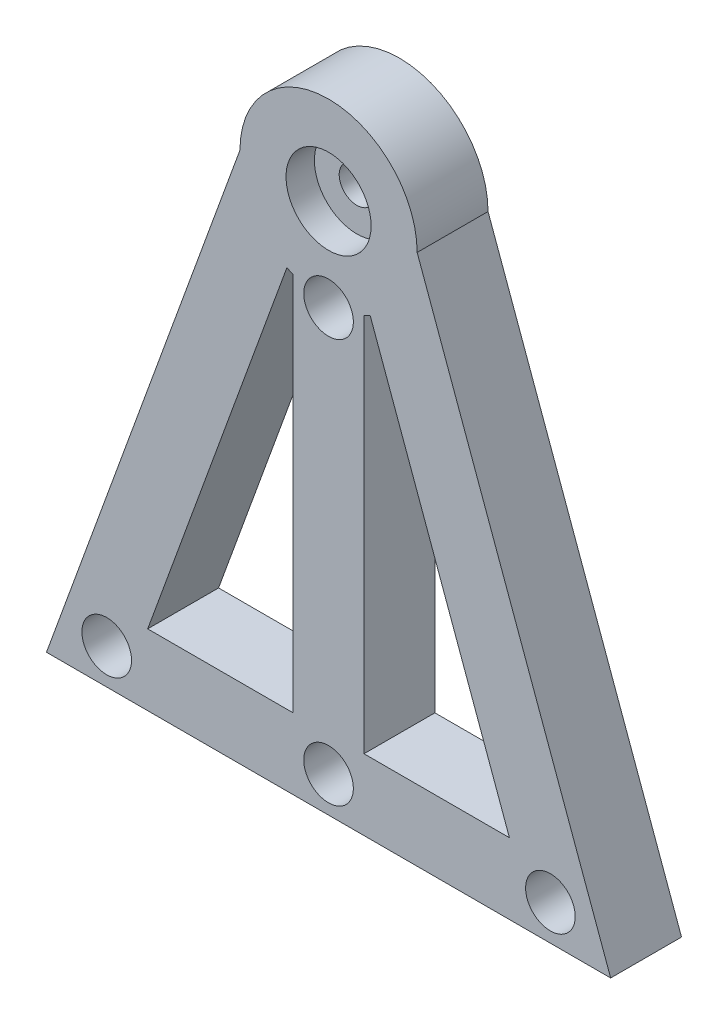
ISO-10303-21;
HEADER;
FILE_DESCRIPTION(('STEP AP214'),'2;1');
FILE_NAME('part.step','',(''),(''),'','','');
FILE_SCHEMA(('AUTOMOTIVE_DESIGN { 1 0 10303 214 1 1 1 1 }'));
ENDSEC;
DATA;
#1=APPLICATION_CONTEXT('core data for automotive mechanical design processes');
#2=APPLICATION_PROTOCOL_DEFINITION('international standard','automotive_design',2000,#1);
#3=PRODUCT_CONTEXT('',#1,'mechanical');
#4=PRODUCT('Part','Part','',(#3));
#5=PRODUCT_RELATED_PRODUCT_CATEGORY('part','',(#4));
#6=PRODUCT_DEFINITION_FORMATION('','',#4);
#7=PRODUCT_DEFINITION_CONTEXT('part definition',#1,'design');
#8=PRODUCT_DEFINITION('design','',#6,#7);
#9=PRODUCT_DEFINITION_SHAPE('','',#8);
#10=(LENGTH_UNIT() NAMED_UNIT(*) SI_UNIT(.MILLI.,.METRE.));
#11=(NAMED_UNIT(*) PLANE_ANGLE_UNIT() SI_UNIT($,.RADIAN.));
#12=(NAMED_UNIT(*) SI_UNIT($,.STERADIAN.) SOLID_ANGLE_UNIT());
#13=UNCERTAINTY_MEASURE_WITH_UNIT(LENGTH_MEASURE(1.E-05),#10,'distance_accuracy_value','');
#14=(GEOMETRIC_REPRESENTATION_CONTEXT(3) GLOBAL_UNCERTAINTY_ASSIGNED_CONTEXT((#13)) GLOBAL_UNIT_ASSIGNED_CONTEXT((#10,
#11,#12)) REPRESENTATION_CONTEXT('',''));
#15=CARTESIAN_POINT('',(0.,0.,0.));
#16=DIRECTION('',(0.,0.,1.));
#17=DIRECTION('',(1.,0.,0.));
#18=AXIS2_PLACEMENT_3D('',#15,#16,#17);
#19=CARTESIAN_POINT('',(0.,62.,-0.000999999999999265));
#20=DIRECTION('',(0.,0.,1.));
#21=DIRECTION('',(1.,0.,0.));
#22=AXIS2_PLACEMENT_3D('',#19,#20,#21);
#23=CYLINDRICAL_SURFACE('',#22,1.5);
#24=CARTESIAN_POINT('',(0.,62.,0.));
#25=DIRECTION('',(0.,0.,1.));
#26=DIRECTION('',(1.,0.,0.));
#27=AXIS2_PLACEMENT_3D('',#24,#25,#26);
#28=CIRCLE('',#27,1.5);
#29=CARTESIAN_POINT('',(1.5,62.,0.));
#30=VERTEX_POINT('',#29);
#31=EDGE_CURVE('E378',#30,#30,#28,.F.);
#32=ORIENTED_EDGE('',*,*,#31,.T.);
#33=EDGE_LOOP('',(#32));
#34=FACE_BOUND('',#33,.T.);
#35=CARTESIAN_POINT('',(0.,62.,5.));
#36=DIRECTION('',(0.,0.,1.));
#37=DIRECTION('',(1.,0.,0.));
#38=AXIS2_PLACEMENT_3D('',#35,#36,#37);
#39=CIRCLE('',#38,1.5);
#40=CARTESIAN_POINT('',(1.5,62.,5.));
#41=VERTEX_POINT('',#40);
#42=EDGE_CURVE('E127',#41,#41,#39,.F.);
#43=ORIENTED_EDGE('',*,*,#42,.F.);
#44=EDGE_LOOP('',(#43));
#45=FACE_BOUND('',#44,.T.);
#46=ADVANCED_FACE('F123',(#34,#45),#23,.F.);
#47=CARTESIAN_POINT('',(31.2977675699655,5.00000000000001,-0.000999999999999265));
#48=DIRECTION('',(0.,0.,1.));
#49=DIRECTION('',(1.,0.,0.));
#50=AXIS2_PLACEMENT_3D('',#47,#48,#49);
#51=CYLINDRICAL_SURFACE('',#50,1.5);
#52=CARTESIAN_POINT('',(31.2977675699655,5.00000000000001,0.));
#53=DIRECTION('',(0.,0.,1.));
#54=DIRECTION('',(1.,0.,0.));
#55=AXIS2_PLACEMENT_3D('',#52,#53,#54);
#56=CIRCLE('',#55,1.5);
#57=CARTESIAN_POINT('',(32.7977675699655,5.00000000000001,0.));
#58=VERTEX_POINT('',#57);
#59=EDGE_CURVE('E374',#58,#58,#56,.F.);
#60=ORIENTED_EDGE('',*,*,#59,.T.);
#61=EDGE_LOOP('',(#60));
#62=FACE_BOUND('',#61,.T.);
#63=CARTESIAN_POINT('',(31.2977675699655,5.00000000000001,5.));
#64=DIRECTION('',(0.,0.,1.));
#65=DIRECTION('',(1.,0.,0.));
#66=AXIS2_PLACEMENT_3D('',#63,#64,#65);
#67=CIRCLE('',#66,1.5);
#68=CARTESIAN_POINT('',(32.7977675699655,5.00000000000001,5.));
#69=VERTEX_POINT('',#68);
#70=EDGE_CURVE('E412',#69,#69,#67,.T.);
#71=ORIENTED_EDGE('',*,*,#70,.T.);
#72=EDGE_LOOP('',(#71));
#73=FACE_BOUND('',#72,.T.);
#74=ADVANCED_FACE('F482',(#62,#73),#51,.F.);
#75=CARTESIAN_POINT('',(0.,5.,-0.000999999999999265));
#76=DIRECTION('',(0.,0.,1.));
#77=DIRECTION('',(1.,0.,0.));
#78=AXIS2_PLACEMENT_3D('',#75,#76,#77);
#79=CYLINDRICAL_SURFACE('',#78,1.5);
#80=CARTESIAN_POINT('',(0.,5.,0.));
#81=DIRECTION('',(0.,0.,1.));
#82=DIRECTION('',(1.,0.,0.));
#83=AXIS2_PLACEMENT_3D('',#80,#81,#82);
#84=CIRCLE('',#83,1.5);
#85=CARTESIAN_POINT('',(1.5,5.,0.));
#86=VERTEX_POINT('',#85);
#87=EDGE_CURVE('E370',#86,#86,#84,.F.);
#88=ORIENTED_EDGE('',*,*,#87,.T.);
#89=EDGE_LOOP('',(#88));
#90=FACE_BOUND('',#89,.T.);
#91=CARTESIAN_POINT('',(0.,5.,5.));
#92=DIRECTION('',(0.,0.,1.));
#93=DIRECTION('',(1.,0.,0.));
#94=AXIS2_PLACEMENT_3D('',#91,#92,#93);
#95=CIRCLE('',#94,1.5);
#96=CARTESIAN_POINT('',(1.5,5.,5.));
#97=VERTEX_POINT('',#96);
#98=EDGE_CURVE('E400',#97,#97,#95,.T.);
#99=ORIENTED_EDGE('',*,*,#98,.T.);
#100=EDGE_LOOP('',(#99));
#101=FACE_BOUND('',#100,.T.);
#102=ADVANCED_FACE('F488',(#90,#101),#79,.F.);
#103=CARTESIAN_POINT('',(-31.2977675699655,4.99999999999999,-0.000999999999999265));
#104=DIRECTION('',(0.,0.,1.));
#105=DIRECTION('',(1.,0.,0.));
#106=AXIS2_PLACEMENT_3D('',#103,#104,#105);
#107=CYLINDRICAL_SURFACE('',#106,1.5);
#108=CARTESIAN_POINT('',(-31.2977675699655,4.99999999999999,0.));
#109=DIRECTION('',(0.,0.,1.));
#110=DIRECTION('',(1.,0.,0.));
#111=AXIS2_PLACEMENT_3D('',#108,#109,#110);
#112=CIRCLE('',#111,1.5);
#113=CARTESIAN_POINT('',(-29.7977675699655,4.99999999999999,0.));
#114=VERTEX_POINT('',#113);
#115=EDGE_CURVE('E367',#114,#114,#112,.F.);
#116=ORIENTED_EDGE('',*,*,#115,.T.);
#117=EDGE_LOOP('',(#116));
#118=FACE_BOUND('',#117,.T.);
#119=CARTESIAN_POINT('',(-31.2977675699655,4.99999999999999,5.));
#120=DIRECTION('',(0.,0.,1.));
#121=DIRECTION('',(1.,0.,0.));
#122=AXIS2_PLACEMENT_3D('',#119,#120,#121);
#123=CIRCLE('',#122,1.5);
#124=CARTESIAN_POINT('',(-29.7977675699655,4.99999999999999,5.));
#125=VERTEX_POINT('',#124);
#126=EDGE_CURVE('E388',#125,#125,#123,.T.);
#127=ORIENTED_EDGE('',*,*,#126,.T.);
#128=EDGE_LOOP('',(#127));
#129=FACE_BOUND('',#128,.T.);
#130=ADVANCED_FACE('F504',(#118,#129),#107,.F.);
#131=CARTESIAN_POINT('',(0.,75.,-0.000999999999999265));
#132=DIRECTION('',(0.,0.,1.));
#133=DIRECTION('',(1.,0.,0.));
#134=AXIS2_PLACEMENT_3D('',#131,#132,#133);
#135=CYLINDRICAL_SURFACE('',#134,2.5);
#136=CARTESIAN_POINT('',(0.,75.,0.));
#137=DIRECTION('',(0.,0.,1.));
#138=DIRECTION('',(1.,0.,0.));
#139=AXIS2_PLACEMENT_3D('',#136,#137,#138);
#140=CIRCLE('',#139,2.5);
#141=CARTESIAN_POINT('',(2.5,75.,0.));
#142=VERTEX_POINT('',#141);
#143=EDGE_CURVE('E258',#142,#142,#140,.F.);
#144=ORIENTED_EDGE('',*,*,#143,.T.);
#145=EDGE_LOOP('',(#144));
#146=FACE_BOUND('',#145,.T.);
#147=CARTESIAN_POINT('',(0.,75.,6.));
#148=DIRECTION('',(0.,0.,1.));
#149=DIRECTION('',(1.,0.,0.));
#150=AXIS2_PLACEMENT_3D('',#147,#148,#149);
#151=CIRCLE('',#150,2.5);
#152=CARTESIAN_POINT('',(2.5,75.,6.));
#153=VERTEX_POINT('',#152);
#154=EDGE_CURVE('E359',#153,#153,#151,.T.);
#155=ORIENTED_EDGE('',*,*,#154,.T.);
#156=EDGE_LOOP('',(#155));
#157=FACE_BOUND('',#156,.T.);
#158=ADVANCED_FACE('F502',(#146,#157),#135,.F.);
#159=CARTESIAN_POINT('',(0.,75.,10.));
#160=DIRECTION('',(0.,0.,-1.));
#161=DIRECTION('',(-1.,0.,0.));
#162=AXIS2_PLACEMENT_3D('',#159,#160,#161);
#163=CYLINDRICAL_SURFACE('',#162,12.5);
#164=CARTESIAN_POINT('',(0.,75.,10.));
#165=DIRECTION('',(0.,0.,1.));
#166=DIRECTION('',(1.,0.,0.));
#167=AXIS2_PLACEMENT_3D('',#164,#165,#166);
#168=CIRCLE('',#167,12.5);
#169=CARTESIAN_POINT('',(-5.87418415032343,63.9662354308201,10.));
#170=VERTEX_POINT('',#169);
#171=CARTESIAN_POINT('',(-5.,63.5435607626104,10.));
#172=VERTEX_POINT('',#171);
#173=EDGE_CURVE('E227',#170,#172,#168,.T.);
#174=ORIENTED_EDGE('',*,*,#173,.F.);
#175=DIRECTION('',(0.,0.,-1.));
#176=VECTOR('',#175,1.);
#177=CARTESIAN_POINT('',(-5.87418415032343,63.9662354308201,10.));
#178=LINE('',#177,#176);
#179=CARTESIAN_POINT('',(-5.87418415032343,63.9662354308201,0.));
#180=VERTEX_POINT('',#179);
#181=EDGE_CURVE('E263',#170,#180,#178,.T.);
#182=ORIENTED_EDGE('',*,*,#181,.T.);
#183=CARTESIAN_POINT('',(0.,75.,0.));
#184=DIRECTION('',(0.,0.,1.));
#185=DIRECTION('',(1.,0.,0.));
#186=AXIS2_PLACEMENT_3D('',#183,#184,#185);
#187=CIRCLE('',#186,12.5);
#188=CARTESIAN_POINT('',(-5.,63.5435607626104,0.));
#189=VERTEX_POINT('',#188);
#190=EDGE_CURVE('E229',#180,#189,#187,.T.);
#191=ORIENTED_EDGE('',*,*,#190,.T.);
#192=DIRECTION('',(0.,0.,-1.));
#193=VECTOR('',#192,1.);
#194=CARTESIAN_POINT('',(-5.,63.5435607626104,10.));
#195=LINE('',#194,#193);
#196=EDGE_CURVE('E224',#189,#172,#195,.F.);
#197=ORIENTED_EDGE('',*,*,#196,.T.);
#198=EDGE_LOOP('',(#174,#182,#191,#197));
#199=FACE_BOUND('',#198,.T.);
#200=ADVANCED_FACE('F225',(#199),#163,.T.);
#201=DIRECTION('',(0.,0.,-1.));
#202=VECTOR('',#201,1.);
#203=CARTESIAN_POINT('',(5.87418415032343,63.9662354308201,10.));
#204=LINE('',#203,#202);
#205=CARTESIAN_POINT('',(5.87418415032343,63.9662354308201,10.));
#206=VERTEX_POINT('',#205);
#207=CARTESIAN_POINT('',(5.87418415032343,63.9662354308201,0.));
#208=VERTEX_POINT('',#207);
#209=EDGE_CURVE('E143',#206,#208,#204,.T.);
#210=ORIENTED_EDGE('',*,*,#209,.F.);
#211=CARTESIAN_POINT('',(5.,63.5435607626104,10.));
#212=VERTEX_POINT('',#211);
#213=EDGE_CURVE('E249',#212,#206,#168,.T.);
#214=ORIENTED_EDGE('',*,*,#213,.F.);
#215=DIRECTION('',(0.,0.,-1.));
#216=VECTOR('',#215,1.);
#217=CARTESIAN_POINT('',(5.,63.5435607626104,10.));
#218=LINE('',#217,#216);
#219=CARTESIAN_POINT('',(5.,63.5435607626104,0.));
#220=VERTEX_POINT('',#219);
#221=EDGE_CURVE('E232',#212,#220,#218,.T.);
#222=ORIENTED_EDGE('',*,*,#221,.T.);
#223=EDGE_CURVE('E261',#220,#208,#187,.T.);
#224=ORIENTED_EDGE('',*,*,#223,.T.);
#225=EDGE_LOOP('',(#210,#214,#222,#224));
#226=FACE_BOUND('',#225,.T.);
#227=ADVANCED_FACE('F341',(#226),#163,.T.);
#228=DIRECTION('',(0.,0.,-1.));
#229=VECTOR('',#228,1.);
#230=CARTESIAN_POINT('',(-12.5,75.,10.));
#231=LINE('',#230,#229);
#232=CARTESIAN_POINT('',(-12.5,75.,10.));
#233=VERTEX_POINT('',#232);
#234=CARTESIAN_POINT('',(-12.5,75.,0.));
#235=VERTEX_POINT('',#234);
#236=EDGE_CURVE('E12',#233,#235,#231,.T.);
#237=ORIENTED_EDGE('',*,*,#236,.F.);
#238=CARTESIAN_POINT('',(12.5,75.,10.));
#239=VERTEX_POINT('',#238);
#240=EDGE_CURVE('E233',#239,#233,#168,.T.);
#241=ORIENTED_EDGE('',*,*,#240,.F.);
#242=DIRECTION('',(0.,0.,-1.));
#243=VECTOR('',#242,1.);
#244=CARTESIAN_POINT('',(12.5,75.,10.));
#245=LINE('',#244,#243);
#246=CARTESIAN_POINT('',(12.5,75.,0.));
#247=VERTEX_POINT('',#246);
#248=EDGE_CURVE('E134',#239,#247,#245,.T.);
#249=ORIENTED_EDGE('',*,*,#248,.T.);
#250=EDGE_CURVE('E255',#247,#235,#187,.T.);
#251=ORIENTED_EDGE('',*,*,#250,.T.);
#252=EDGE_LOOP('',(#237,#241,#249,#251));
#253=FACE_BOUND('',#252,.T.);
#254=ADVANCED_FACE('F453',(#253),#163,.T.);
#255=CARTESIAN_POINT('',(0.,75.,0.));
#256=DIRECTION('',(0.,0.,1.));
#257=DIRECTION('',(1.,0.,0.));
#258=AXIS2_PLACEMENT_3D('',#255,#256,#257);
#259=PLANE('',#258);
#260=ORIENTED_EDGE('',*,*,#115,.F.);
#261=EDGE_LOOP('',(#260));
#262=FACE_BOUND('',#261,.T.);
#263=ORIENTED_EDGE('',*,*,#87,.F.);
#264=EDGE_LOOP('',(#263));
#265=FACE_BOUND('',#264,.T.);
#266=ORIENTED_EDGE('',*,*,#59,.F.);
#267=EDGE_LOOP('',(#266));
#268=FACE_BOUND('',#267,.T.);
#269=ORIENTED_EDGE('',*,*,#31,.F.);
#270=EDGE_LOOP('',(#269));
#271=FACE_BOUND('',#270,.T.);
#272=ORIENTED_EDGE('',*,*,#143,.F.);
#273=EDGE_LOOP('',(#272));
#274=FACE_BOUND('',#273,.T.);
#275=DIRECTION('',(0.,1.,0.));
#276=VECTOR('',#275,1.);
#277=CARTESIAN_POINT('',(5.,10.,0.));
#278=LINE('',#277,#276);
#279=CARTESIAN_POINT('',(5.,9.99999999999999,0.));
#280=VERTEX_POINT('',#279);
#281=EDGE_CURVE('E335',#280,#220,#278,.T.);
#282=ORIENTED_EDGE('',*,*,#281,.F.);
#283=DIRECTION('',(1.,0.,0.));
#284=VECTOR('',#283,1.);
#285=CARTESIAN_POINT('',(-25.5162875025443,9.99999999999999,0.));
#286=LINE('',#285,#284);
#287=CARTESIAN_POINT('',(25.5162875025443,9.99999999999999,0.));
#288=VERTEX_POINT('',#287);
#289=EDGE_CURVE('E293',#280,#288,#286,.T.);
#290=ORIENTED_EDGE('',*,*,#289,.T.);
#291=DIRECTION('',(0.342020143325673,-0.939692620785907,0.));
#292=VECTOR('',#291,1.);
#293=CARTESIAN_POINT('',(5.87418415032343,63.9662354308201,0.));
#294=LINE('',#293,#292);
#295=EDGE_CURVE('E298',#208,#288,#294,.T.);
#296=ORIENTED_EDGE('',*,*,#295,.F.);
#297=ORIENTED_EDGE('',*,*,#223,.F.);
#298=EDGE_LOOP('',(#282,#290,#296,#297));
#299=FACE_BOUND('',#298,.T.);
#300=ORIENTED_EDGE('',*,*,#250,.F.);
#301=DIRECTION('',(0.342020143325673,-0.939692620785907,0.));
#302=VECTOR('',#301,1.);
#303=CARTESIAN_POINT('',(12.5,75.,0.));
#304=LINE('',#303,#302);
#305=CARTESIAN_POINT('',(39.7977675699655,0.,0.));
#306=VERTEX_POINT('',#305);
#307=EDGE_CURVE('E302',#247,#306,#304,.T.);
#308=ORIENTED_EDGE('',*,*,#307,.T.);
#309=DIRECTION('',(1.,0.,0.));
#310=VECTOR('',#309,1.);
#311=CARTESIAN_POINT('',(-39.7977675699655,0.,0.));
#312=LINE('',#311,#310);
#313=CARTESIAN_POINT('',(-39.7977675699655,0.,0.));
#314=VERTEX_POINT('',#313);
#315=EDGE_CURVE('E306',#314,#306,#312,.T.);
#316=ORIENTED_EDGE('',*,*,#315,.F.);
#317=DIRECTION('',(-0.342020143325673,-0.939692620785907,0.));
#318=VECTOR('',#317,1.);
#319=CARTESIAN_POINT('',(-12.5,75.,0.));
#320=LINE('',#319,#318);
#321=EDGE_CURVE('E271',#235,#314,#320,.T.);
#322=ORIENTED_EDGE('',*,*,#321,.F.);
#323=EDGE_LOOP('',(#300,#308,#316,#322));
#324=FACE_BOUND('',#323,.T.);
#325=CARTESIAN_POINT('',(-25.5162875025443,9.99999999999999,0.));
#326=VERTEX_POINT('',#325);
#327=CARTESIAN_POINT('',(-5.,9.99999999999999,0.));
#328=VERTEX_POINT('',#327);
#329=EDGE_CURVE('E294',#326,#328,#286,.T.);
#330=ORIENTED_EDGE('',*,*,#329,.T.);
#331=DIRECTION('',(0.,1.,0.));
#332=VECTOR('',#331,1.);
#333=CARTESIAN_POINT('',(-5.,10.,0.));
#334=LINE('',#333,#332);
#335=EDGE_CURVE('E333',#328,#189,#334,.T.);
#336=ORIENTED_EDGE('',*,*,#335,.T.);
#337=ORIENTED_EDGE('',*,*,#190,.F.);
#338=DIRECTION('',(-0.342020143325673,-0.939692620785907,0.));
#339=VECTOR('',#338,1.);
#340=CARTESIAN_POINT('',(-5.87418415032343,63.9662354308201,0.));
#341=LINE('',#340,#339);
#342=EDGE_CURVE('E241',#180,#326,#341,.T.);
#343=ORIENTED_EDGE('',*,*,#342,.T.);
#344=EDGE_LOOP('',(#330,#336,#337,#343));
#345=FACE_BOUND('',#344,.T.);
#346=ADVANCED_FACE('F347',(#262,#265,#268,#271,#274,#299,#324,#345),#259,.F.);
#347=CARTESIAN_POINT('',(0.,75.,10.));
#348=DIRECTION('',(0.,0.,1.));
#349=DIRECTION('',(1.,0.,0.));
#350=AXIS2_PLACEMENT_3D('',#347,#348,#349);
#351=PLANE('',#350);
#352=CARTESIAN_POINT('',(-31.2977675699655,4.99999999999999,10.));
#353=DIRECTION('',(0.,0.,1.));
#354=DIRECTION('',(1.,0.,0.));
#355=AXIS2_PLACEMENT_3D('',#352,#353,#354);
#356=CIRCLE('',#355,3.5);
#357=CARTESIAN_POINT('',(-27.7977675699655,4.99999999999999,10.));
#358=VERTEX_POINT('',#357);
#359=EDGE_CURVE('E392',#358,#358,#356,.T.);
#360=ORIENTED_EDGE('',*,*,#359,.F.);
#361=EDGE_LOOP('',(#360));
#362=FACE_BOUND('',#361,.T.);
#363=CARTESIAN_POINT('',(0.,5.,10.));
#364=DIRECTION('',(0.,0.,1.));
#365=DIRECTION('',(1.,0.,0.));
#366=AXIS2_PLACEMENT_3D('',#363,#364,#365);
#367=CIRCLE('',#366,3.5);
#368=CARTESIAN_POINT('',(3.5,5.,10.));
#369=VERTEX_POINT('',#368);
#370=EDGE_CURVE('E396',#369,#369,#367,.T.);
#371=ORIENTED_EDGE('',*,*,#370,.F.);
#372=EDGE_LOOP('',(#371));
#373=FACE_BOUND('',#372,.T.);
#374=CARTESIAN_POINT('',(31.2977675699655,5.00000000000001,10.));
#375=DIRECTION('',(0.,0.,1.));
#376=DIRECTION('',(1.,0.,0.));
#377=AXIS2_PLACEMENT_3D('',#374,#375,#376);
#378=CIRCLE('',#377,3.5);
#379=CARTESIAN_POINT('',(34.7977675699656,5.00000000000001,10.));
#380=VERTEX_POINT('',#379);
#381=EDGE_CURVE('E408',#380,#380,#378,.T.);
#382=ORIENTED_EDGE('',*,*,#381,.F.);
#383=EDGE_LOOP('',(#382));
#384=FACE_BOUND('',#383,.T.);
#385=CARTESIAN_POINT('',(0.,62.,10.));
#386=DIRECTION('',(0.,0.,1.));
#387=DIRECTION('',(1.,0.,0.));
#388=AXIS2_PLACEMENT_3D('',#385,#386,#387);
#389=CIRCLE('',#388,3.5);
#390=CARTESIAN_POINT('',(3.5,62.,10.));
#391=VERTEX_POINT('',#390);
#392=EDGE_CURVE('E420',#391,#391,#389,.T.);
#393=ORIENTED_EDGE('',*,*,#392,.F.);
#394=EDGE_LOOP('',(#393));
#395=FACE_BOUND('',#394,.T.);
#396=CARTESIAN_POINT('',(0.,75.,10.));
#397=DIRECTION('',(0.,0.,1.));
#398=DIRECTION('',(1.,0.,0.));
#399=AXIS2_PLACEMENT_3D('',#396,#397,#398);
#400=CIRCLE('',#399,6.);
#401=CARTESIAN_POINT('',(6.,75.,10.));
#402=VERTEX_POINT('',#401);
#403=EDGE_CURVE('E363',#402,#402,#400,.T.);
#404=ORIENTED_EDGE('',*,*,#403,.F.);
#405=EDGE_LOOP('',(#404));
#406=FACE_BOUND('',#405,.T.);
#407=DIRECTION('',(1.,0.,0.));
#408=VECTOR('',#407,1.);
#409=CARTESIAN_POINT('',(-25.5162875025443,9.99999999999999,10.));
#410=LINE('',#409,#408);
#411=CARTESIAN_POINT('',(5.,9.99999999999999,10.));
#412=VERTEX_POINT('',#411);
#413=CARTESIAN_POINT('',(25.5162875025443,9.99999999999999,10.));
#414=VERTEX_POINT('',#413);
#415=EDGE_CURVE('E270',#412,#414,#410,.T.);
#416=ORIENTED_EDGE('',*,*,#415,.F.);
#417=DIRECTION('',(0.,1.,0.));
#418=VECTOR('',#417,1.);
#419=CARTESIAN_POINT('',(5.,10.,10.));
#420=LINE('',#419,#418);
#421=EDGE_CURVE('E242',#412,#212,#420,.T.);
#422=ORIENTED_EDGE('',*,*,#421,.T.);
#423=ORIENTED_EDGE('',*,*,#213,.T.);
#424=DIRECTION('',(0.342020143325673,-0.939692620785907,0.));
#425=VECTOR('',#424,1.);
#426=CARTESIAN_POINT('',(5.87418415032343,63.9662354308201,10.));
#427=LINE('',#426,#425);
#428=EDGE_CURVE('E275',#206,#414,#427,.T.);
#429=ORIENTED_EDGE('',*,*,#428,.T.);
#430=EDGE_LOOP('',(#416,#422,#423,#429));
#431=FACE_BOUND('',#430,.T.);
#432=DIRECTION('',(0.342020143325673,-0.939692620785907,0.));
#433=VECTOR('',#432,1.);
#434=CARTESIAN_POINT('',(12.5,75.,10.));
#435=LINE('',#434,#433);
#436=CARTESIAN_POINT('',(39.7977675699655,0.,10.));
#437=VERTEX_POINT('',#436);
#438=EDGE_CURVE('E279',#239,#437,#435,.T.);
#439=ORIENTED_EDGE('',*,*,#438,.F.);
#440=ORIENTED_EDGE('',*,*,#240,.T.);
#441=DIRECTION('',(-0.342020143325673,-0.939692620785907,0.));
#442=VECTOR('',#441,1.);
#443=CARTESIAN_POINT('',(-12.5,75.,10.));
#444=LINE('',#443,#442);
#445=CARTESIAN_POINT('',(-39.7977675699655,0.,10.));
#446=VERTEX_POINT('',#445);
#447=EDGE_CURVE('E286',#233,#446,#444,.T.);
#448=ORIENTED_EDGE('',*,*,#447,.T.);
#449=DIRECTION('',(1.,0.,0.));
#450=VECTOR('',#449,1.);
#451=CARTESIAN_POINT('',(-39.7977675699655,0.,10.));
#452=LINE('',#451,#450);
#453=EDGE_CURVE('E283',#446,#437,#452,.T.);
#454=ORIENTED_EDGE('',*,*,#453,.T.);
#455=EDGE_LOOP('',(#439,#440,#448,#454));
#456=FACE_BOUND('',#455,.T.);
#457=DIRECTION('',(0.,1.,0.));
#458=VECTOR('',#457,1.);
#459=CARTESIAN_POINT('',(-5.,10.,10.));
#460=LINE('',#459,#458);
#461=CARTESIAN_POINT('',(-5.,9.99999999999999,10.));
#462=VERTEX_POINT('',#461);
#463=EDGE_CURVE('E235',#462,#172,#460,.T.);
#464=ORIENTED_EDGE('',*,*,#463,.F.);
#465=CARTESIAN_POINT('',(-25.5162875025443,9.99999999999999,10.));
#466=VERTEX_POINT('',#465);
#467=EDGE_CURVE('E272',#466,#462,#410,.T.);
#468=ORIENTED_EDGE('',*,*,#467,.F.);
#469=DIRECTION('',(-0.342020143325673,-0.939692620785907,0.));
#470=VECTOR('',#469,1.);
#471=CARTESIAN_POINT('',(-5.87418415032343,63.9662354308201,10.));
#472=LINE('',#471,#470);
#473=EDGE_CURVE('E247',#170,#466,#472,.T.);
#474=ORIENTED_EDGE('',*,*,#473,.F.);
#475=ORIENTED_EDGE('',*,*,#173,.T.);
#476=EDGE_LOOP('',(#464,#468,#474,#475));
#477=FACE_BOUND('',#476,.T.);
#478=ADVANCED_FACE('F245',(#362,#373,#384,#395,#406,#431,#456,#477),#351,.T.);
#479=CARTESIAN_POINT('',(-12.5,75.,10.));
#480=DIRECTION('',(0.939692620785907,-0.342020143325673,0.));
#481=DIRECTION('',(0.342020143325673,0.939692620785907,0.));
#482=AXIS2_PLACEMENT_3D('',#479,#480,#481);
#483=PLANE('',#482);
#484=ORIENTED_EDGE('',*,*,#321,.T.);
#485=DIRECTION('',(0.,0.,-1.));
#486=VECTOR('',#485,1.);
#487=CARTESIAN_POINT('',(-39.7977675699655,0.,10.));
#488=LINE('',#487,#486);
#489=EDGE_CURVE('E312',#446,#314,#488,.T.);
#490=ORIENTED_EDGE('',*,*,#489,.F.);
#491=ORIENTED_EDGE('',*,*,#447,.F.);
#492=ORIENTED_EDGE('',*,*,#236,.T.);
#493=EDGE_LOOP('',(#484,#490,#491,#492));
#494=FACE_BOUND('',#493,.T.);
#495=ADVANCED_FACE('F441',(#494),#483,.F.);
#496=CARTESIAN_POINT('',(-39.7977675699655,0.,10.));
#497=DIRECTION('',(0.,1.,0.));
#498=DIRECTION('',(-1.,0.,0.));
#499=AXIS2_PLACEMENT_3D('',#496,#497,#498);
#500=PLANE('',#499);
#501=ORIENTED_EDGE('',*,*,#315,.T.);
#502=DIRECTION('',(0.,0.,-1.));
#503=VECTOR('',#502,1.);
#504=CARTESIAN_POINT('',(39.7977675699655,0.,10.));
#505=LINE('',#504,#503);
#506=EDGE_CURVE('E316',#437,#306,#505,.T.);
#507=ORIENTED_EDGE('',*,*,#506,.F.);
#508=ORIENTED_EDGE('',*,*,#453,.F.);
#509=ORIENTED_EDGE('',*,*,#489,.T.);
#510=EDGE_LOOP('',(#501,#507,#508,#509));
#511=FACE_BOUND('',#510,.T.);
#512=ADVANCED_FACE('F461',(#511),#500,.F.);
#513=CARTESIAN_POINT('',(12.5,75.,10.));
#514=DIRECTION('',(0.939692620785907,0.342020143325673,0.));
#515=DIRECTION('',(-0.342020143325673,0.939692620785907,0.));
#516=AXIS2_PLACEMENT_3D('',#513,#514,#515);
#517=PLANE('',#516);
#518=ORIENTED_EDGE('',*,*,#307,.F.);
#519=ORIENTED_EDGE('',*,*,#248,.F.);
#520=ORIENTED_EDGE('',*,*,#438,.T.);
#521=ORIENTED_EDGE('',*,*,#506,.T.);
#522=EDGE_LOOP('',(#518,#519,#520,#521));
#523=FACE_BOUND('',#522,.T.);
#524=ADVANCED_FACE('F462',(#523),#517,.T.);
#525=CARTESIAN_POINT('',(5.87418415032343,63.9662354308201,10.));
#526=DIRECTION('',(0.939692620785907,0.342020143325673,0.));
#527=DIRECTION('',(-0.342020143325673,0.939692620785907,0.));
#528=AXIS2_PLACEMENT_3D('',#525,#526,#527);
#529=PLANE('',#528);
#530=ORIENTED_EDGE('',*,*,#295,.T.);
#531=DIRECTION('',(0.,0.,-1.));
#532=VECTOR('',#531,1.);
#533=CARTESIAN_POINT('',(25.5162875025443,9.99999999999999,10.));
#534=LINE('',#533,#532);
#535=EDGE_CURVE('E319',#414,#288,#534,.T.);
#536=ORIENTED_EDGE('',*,*,#535,.F.);
#537=ORIENTED_EDGE('',*,*,#428,.F.);
#538=ORIENTED_EDGE('',*,*,#209,.T.);
#539=EDGE_LOOP('',(#530,#536,#537,#538));
#540=FACE_BOUND('',#539,.T.);
#541=ADVANCED_FACE('F515',(#540),#529,.F.);
#542=CARTESIAN_POINT('',(-25.5162875025443,9.99999999999999,10.));
#543=DIRECTION('',(0.,1.,0.));
#544=DIRECTION('',(-1.,0.,0.));
#545=AXIS2_PLACEMENT_3D('',#542,#543,#544);
#546=PLANE('',#545);
#547=ORIENTED_EDGE('',*,*,#289,.F.);
#548=DIRECTION('',(0.,0.,1.));
#549=VECTOR('',#548,1.);
#550=CARTESIAN_POINT('',(5.,9.99999999999999,10.));
#551=LINE('',#550,#549);
#552=EDGE_CURVE('E190',#280,#412,#551,.T.);
#553=ORIENTED_EDGE('',*,*,#552,.T.);
#554=ORIENTED_EDGE('',*,*,#415,.T.);
#555=ORIENTED_EDGE('',*,*,#535,.T.);
#556=EDGE_LOOP('',(#547,#553,#554,#555));
#557=FACE_BOUND('',#556,.T.);
#558=ADVANCED_FACE('F479',(#557),#546,.T.);
#559=DIRECTION('',(0.,0.,1.));
#560=VECTOR('',#559,1.);
#561=CARTESIAN_POINT('',(-5.,9.99999999999999,10.));
#562=LINE('',#561,#560);
#563=EDGE_CURVE('E184',#328,#462,#562,.T.);
#564=ORIENTED_EDGE('',*,*,#563,.F.);
#565=ORIENTED_EDGE('',*,*,#329,.F.);
#566=DIRECTION('',(0.,0.,-1.));
#567=VECTOR('',#566,1.);
#568=CARTESIAN_POINT('',(-25.5162875025443,9.99999999999999,10.));
#569=LINE('',#568,#567);
#570=EDGE_CURVE('E289',#466,#326,#569,.T.);
#571=ORIENTED_EDGE('',*,*,#570,.F.);
#572=ORIENTED_EDGE('',*,*,#467,.T.);
#573=EDGE_LOOP('',(#564,#565,#571,#572));
#574=FACE_BOUND('',#573,.T.);
#575=ADVANCED_FACE('F470',(#574),#546,.T.);
#576=CARTESIAN_POINT('',(-5.87418415032343,63.9662354308201,10.));
#577=DIRECTION('',(0.939692620785907,-0.342020143325673,0.));
#578=DIRECTION('',(0.342020143325673,0.939692620785907,0.));
#579=AXIS2_PLACEMENT_3D('',#576,#577,#578);
#580=PLANE('',#579);
#581=ORIENTED_EDGE('',*,*,#342,.F.);
#582=ORIENTED_EDGE('',*,*,#181,.F.);
#583=ORIENTED_EDGE('',*,*,#473,.T.);
#584=ORIENTED_EDGE('',*,*,#570,.T.);
#585=EDGE_LOOP('',(#581,#582,#583,#584));
#586=FACE_BOUND('',#585,.T.);
#587=ADVANCED_FACE('F472',(#586),#580,.T.);
#588=CARTESIAN_POINT('',(5.,10.,10.));
#589=DIRECTION('',(-1.,0.,0.));
#590=DIRECTION('',(0.,0.,1.));
#591=AXIS2_PLACEMENT_3D('',#588,#589,#590);
#592=PLANE('',#591);
#593=ORIENTED_EDGE('',*,*,#281,.T.);
#594=ORIENTED_EDGE('',*,*,#221,.F.);
#595=ORIENTED_EDGE('',*,*,#421,.F.);
#596=ORIENTED_EDGE('',*,*,#552,.F.);
#597=EDGE_LOOP('',(#593,#594,#595,#596));
#598=FACE_BOUND('',#597,.T.);
#599=ADVANCED_FACE('F125',(#598),#592,.F.);
#600=CARTESIAN_POINT('',(-5.,10.,10.));
#601=DIRECTION('',(-1.,0.,0.));
#602=DIRECTION('',(0.,0.,1.));
#603=AXIS2_PLACEMENT_3D('',#600,#601,#602);
#604=PLANE('',#603);
#605=ORIENTED_EDGE('',*,*,#335,.F.);
#606=ORIENTED_EDGE('',*,*,#563,.T.);
#607=ORIENTED_EDGE('',*,*,#463,.T.);
#608=ORIENTED_EDGE('',*,*,#196,.F.);
#609=EDGE_LOOP('',(#605,#606,#607,#608));
#610=FACE_BOUND('',#609,.T.);
#611=ADVANCED_FACE('F236',(#610),#604,.T.);
#612=CARTESIAN_POINT('',(0.,75.,6.));
#613=DIRECTION('',(0.,0.,1.));
#614=DIRECTION('',(1.,0.,0.));
#615=AXIS2_PLACEMENT_3D('',#612,#613,#614);
#616=CYLINDRICAL_SURFACE('',#615,6.);
#617=CARTESIAN_POINT('',(0.,75.,6.));
#618=DIRECTION('',(0.,0.,1.));
#619=DIRECTION('',(1.,0.,0.));
#620=AXIS2_PLACEMENT_3D('',#617,#618,#619);
#621=CIRCLE('',#620,6.);
#622=CARTESIAN_POINT('',(6.,75.,6.));
#623=VERTEX_POINT('',#622);
#624=EDGE_CURVE('E356',#623,#623,#621,.T.);
#625=ORIENTED_EDGE('',*,*,#624,.F.);
#626=EDGE_LOOP('',(#625));
#627=FACE_BOUND('',#626,.T.);
#628=ORIENTED_EDGE('',*,*,#403,.T.);
#629=EDGE_LOOP('',(#628));
#630=FACE_BOUND('',#629,.T.);
#631=ADVANCED_FACE('F444',(#627,#630),#616,.F.);
#632=CARTESIAN_POINT('',(0.,0.,6.));
#633=DIRECTION('',(0.,0.,1.));
#634=DIRECTION('',(1.,0.,0.));
#635=AXIS2_PLACEMENT_3D('',#632,#633,#634);
#636=PLANE('',#635);
#637=ORIENTED_EDGE('',*,*,#154,.F.);
#638=EDGE_LOOP('',(#637));
#639=FACE_BOUND('',#638,.T.);
#640=ORIENTED_EDGE('',*,*,#624,.T.);
#641=EDGE_LOOP('',(#640));
#642=FACE_BOUND('',#641,.T.);
#643=ADVANCED_FACE('F494',(#639,#642),#636,.T.);
#644=CARTESIAN_POINT('',(-31.2977675699655,4.99999999999999,5.));
#645=DIRECTION('',(0.,0.,1.));
#646=DIRECTION('',(1.,0.,0.));
#647=AXIS2_PLACEMENT_3D('',#644,#645,#646);
#648=CYLINDRICAL_SURFACE('',#647,3.5);
#649=CARTESIAN_POINT('',(-31.2977675699655,4.99999999999999,5.));
#650=DIRECTION('',(0.,0.,1.));
#651=DIRECTION('',(1.,0.,0.));
#652=AXIS2_PLACEMENT_3D('',#649,#650,#651);
#653=CIRCLE('',#652,3.5);
#654=CARTESIAN_POINT('',(-27.7977675699655,4.99999999999999,5.));
#655=VERTEX_POINT('',#654);
#656=EDGE_CURVE('E385',#655,#655,#653,.T.);
#657=ORIENTED_EDGE('',*,*,#656,.F.);
#658=EDGE_LOOP('',(#657));
#659=FACE_BOUND('',#658,.T.);
#660=ORIENTED_EDGE('',*,*,#359,.T.);
#661=EDGE_LOOP('',(#660));
#662=FACE_BOUND('',#661,.T.);
#663=ADVANCED_FACE('F497',(#659,#662),#648,.F.);
#664=CARTESIAN_POINT('',(0.,0.,5.));
#665=DIRECTION('',(0.,0.,1.));
#666=DIRECTION('',(1.,0.,0.));
#667=AXIS2_PLACEMENT_3D('',#664,#665,#666);
#668=PLANE('',#667);
#669=ORIENTED_EDGE('',*,*,#126,.F.);
#670=EDGE_LOOP('',(#669));
#671=FACE_BOUND('',#670,.T.);
#672=ORIENTED_EDGE('',*,*,#656,.T.);
#673=EDGE_LOOP('',(#672));
#674=FACE_BOUND('',#673,.T.);
#675=ADVANCED_FACE('F597',(#671,#674),#668,.T.);
#676=CARTESIAN_POINT('',(0.,5.,5.));
#677=DIRECTION('',(0.,0.,1.));
#678=DIRECTION('',(1.,0.,0.));
#679=AXIS2_PLACEMENT_3D('',#676,#677,#678);
#680=CYLINDRICAL_SURFACE('',#679,3.5);
#681=CARTESIAN_POINT('',(0.,5.,5.));
#682=DIRECTION('',(0.,0.,1.));
#683=DIRECTION('',(1.,0.,0.));
#684=AXIS2_PLACEMENT_3D('',#681,#682,#683);
#685=CIRCLE('',#684,3.5);
#686=CARTESIAN_POINT('',(3.5,5.,5.));
#687=VERTEX_POINT('',#686);
#688=EDGE_CURVE('E404',#687,#687,#685,.T.);
#689=ORIENTED_EDGE('',*,*,#688,.F.);
#690=EDGE_LOOP('',(#689));
#691=FACE_BOUND('',#690,.T.);
#692=ORIENTED_EDGE('',*,*,#370,.T.);
#693=EDGE_LOOP('',(#692));
#694=FACE_BOUND('',#693,.T.);
#695=ADVANCED_FACE('F607',(#691,#694),#680,.F.);
#696=CARTESIAN_POINT('',(0.,0.,5.));
#697=DIRECTION('',(0.,0.,1.));
#698=DIRECTION('',(1.,0.,0.));
#699=AXIS2_PLACEMENT_3D('',#696,#697,#698);
#700=PLANE('',#699);
#701=ORIENTED_EDGE('',*,*,#98,.F.);
#702=EDGE_LOOP('',(#701));
#703=FACE_BOUND('',#702,.T.);
#704=ORIENTED_EDGE('',*,*,#688,.T.);
#705=EDGE_LOOP('',(#704));
#706=FACE_BOUND('',#705,.T.);
#707=ADVANCED_FACE('F617',(#703,#706),#700,.T.);
#708=CARTESIAN_POINT('',(31.2977675699655,5.00000000000001,5.));
#709=DIRECTION('',(0.,0.,1.));
#710=DIRECTION('',(1.,0.,0.));
#711=AXIS2_PLACEMENT_3D('',#708,#709,#710);
#712=CYLINDRICAL_SURFACE('',#711,3.5);
#713=CARTESIAN_POINT('',(31.2977675699655,5.00000000000001,5.));
#714=DIRECTION('',(0.,0.,1.));
#715=DIRECTION('',(1.,0.,0.));
#716=AXIS2_PLACEMENT_3D('',#713,#714,#715);
#717=CIRCLE('',#716,3.5);
#718=CARTESIAN_POINT('',(34.7977675699656,5.00000000000001,5.));
#719=VERTEX_POINT('',#718);
#720=EDGE_CURVE('E416',#719,#719,#717,.T.);
#721=ORIENTED_EDGE('',*,*,#720,.F.);
#722=EDGE_LOOP('',(#721));
#723=FACE_BOUND('',#722,.T.);
#724=ORIENTED_EDGE('',*,*,#381,.T.);
#725=EDGE_LOOP('',(#724));
#726=FACE_BOUND('',#725,.T.);
#727=ADVANCED_FACE('F627',(#723,#726),#712,.F.);
#728=CARTESIAN_POINT('',(0.,0.,5.));
#729=DIRECTION('',(0.,0.,1.));
#730=DIRECTION('',(1.,0.,0.));
#731=AXIS2_PLACEMENT_3D('',#728,#729,#730);
#732=PLANE('',#731);
#733=ORIENTED_EDGE('',*,*,#70,.F.);
#734=EDGE_LOOP('',(#733));
#735=FACE_BOUND('',#734,.T.);
#736=ORIENTED_EDGE('',*,*,#720,.T.);
#737=EDGE_LOOP('',(#736));
#738=FACE_BOUND('',#737,.T.);
#739=ADVANCED_FACE('F637',(#735,#738),#732,.T.);
#740=CARTESIAN_POINT('',(0.,62.,5.));
#741=DIRECTION('',(0.,0.,1.));
#742=DIRECTION('',(1.,0.,0.));
#743=AXIS2_PLACEMENT_3D('',#740,#741,#742);
#744=PLANE('',#743);
#745=CARTESIAN_POINT('',(0.,62.,5.));
#746=DIRECTION('',(0.,0.,1.));
#747=DIRECTION('',(1.,0.,0.));
#748=AXIS2_PLACEMENT_3D('',#745,#746,#747);
#749=CIRCLE('',#748,3.5);
#750=CARTESIAN_POINT('',(3.5,62.,5.));
#751=VERTEX_POINT('',#750);
#752=EDGE_CURVE('E424',#751,#751,#749,.T.);
#753=ORIENTED_EDGE('',*,*,#752,.T.);
#754=EDGE_LOOP('',(#753));
#755=FACE_BOUND('',#754,.T.);
#756=ORIENTED_EDGE('',*,*,#42,.T.);
#757=EDGE_LOOP('',(#756));
#758=FACE_BOUND('',#757,.T.);
#759=ADVANCED_FACE('F430',(#755,#758),#744,.T.);
#760=CARTESIAN_POINT('',(0.,62.,5.));
#761=DIRECTION('',(0.,0.,1.));
#762=DIRECTION('',(1.,0.,0.));
#763=AXIS2_PLACEMENT_3D('',#760,#761,#762);
#764=CYLINDRICAL_SURFACE('',#763,3.5);
#765=ORIENTED_EDGE('',*,*,#752,.F.);
#766=EDGE_LOOP('',(#765));
#767=FACE_BOUND('',#766,.T.);
#768=ORIENTED_EDGE('',*,*,#392,.T.);
#769=EDGE_LOOP('',(#768));
#770=FACE_BOUND('',#769,.T.);
#771=ADVANCED_FACE('F433',(#767,#770),#764,.F.);
#772=CLOSED_SHELL('',(#46,#74,#102,#130,#158,#200,#227,#254,#346,#478,#495,#512,#524,#541,#558,
#575,#587,#599,#611,#631,#643,#663,#675,#695,#707,#727,#739,#759,#771));
#773=MANIFOLD_SOLID_BREP('B2',#772);
#774=ADVANCED_BREP_SHAPE_REPRESENTATION('',(#18,#773),#14);
#775=SHAPE_DEFINITION_REPRESENTATION(#9,#774);
ENDSEC;
END-ISO-10303-21;
